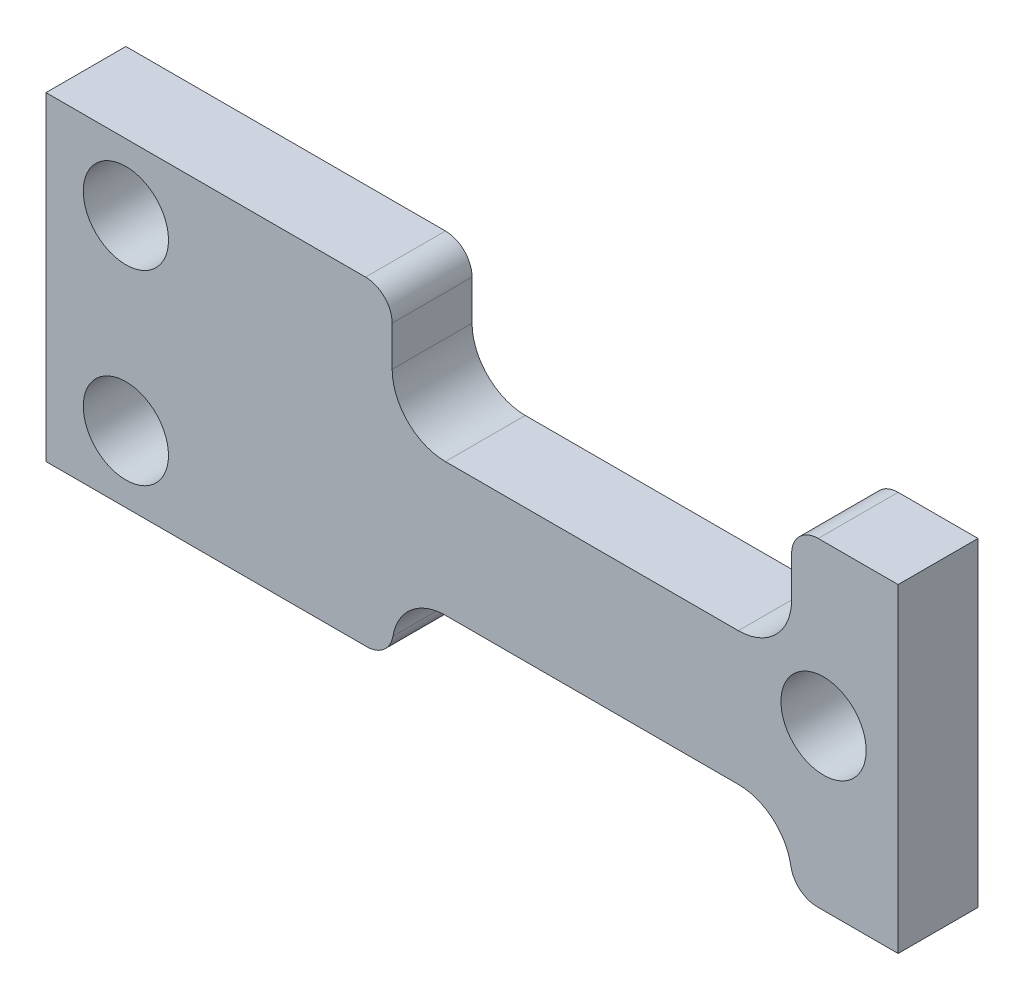
ISO-10303-21;
HEADER;
FILE_DESCRIPTION(('STEP AP214'),'2;1');
FILE_NAME('part.step','',(''),(''),'','','');
FILE_SCHEMA(('AUTOMOTIVE_DESIGN { 1 0 10303 214 1 1 1 1 }'));
ENDSEC;
DATA;
#1=APPLICATION_CONTEXT('core data for automotive mechanical design processes');
#2=APPLICATION_PROTOCOL_DEFINITION('international standard','automotive_design',2000,#1);
#3=PRODUCT_CONTEXT('',#1,'mechanical');
#4=PRODUCT('Part','Part','',(#3));
#5=PRODUCT_RELATED_PRODUCT_CATEGORY('part','',(#4));
#6=PRODUCT_DEFINITION_FORMATION('','',#4);
#7=PRODUCT_DEFINITION_CONTEXT('part definition',#1,'design');
#8=PRODUCT_DEFINITION('design','',#6,#7);
#9=PRODUCT_DEFINITION_SHAPE('','',#8);
#10=(LENGTH_UNIT() NAMED_UNIT(*) SI_UNIT(.MILLI.,.METRE.));
#11=(NAMED_UNIT(*) PLANE_ANGLE_UNIT() SI_UNIT($,.RADIAN.));
#12=(NAMED_UNIT(*) SI_UNIT($,.STERADIAN.) SOLID_ANGLE_UNIT());
#13=UNCERTAINTY_MEASURE_WITH_UNIT(LENGTH_MEASURE(1.E-05),#10,'distance_accuracy_value','');
#14=(GEOMETRIC_REPRESENTATION_CONTEXT(3) GLOBAL_UNCERTAINTY_ASSIGNED_CONTEXT((#13)) GLOBAL_UNIT_ASSIGNED_CONTEXT((#10,
#11,#12)) REPRESENTATION_CONTEXT('',''));
#15=CARTESIAN_POINT('',(0.,0.,0.));
#16=DIRECTION('',(0.,0.,1.));
#17=DIRECTION('',(1.,0.,0.));
#18=AXIS2_PLACEMENT_3D('',#15,#16,#17);
#19=CARTESIAN_POINT('',(0.,0.,3.));
#20=DIRECTION('',(0.,0.,-1.));
#21=DIRECTION('',(-1.,0.,0.));
#22=AXIS2_PLACEMENT_3D('',#19,#20,#21);
#23=PLANE('',#22);
#24=CARTESIAN_POINT('',(29.2,13.5,3.));
#25=DIRECTION('',(0.,0.,1.));
#26=DIRECTION('',(1.,0.,0.));
#27=AXIS2_PLACEMENT_3D('',#24,#25,#26);
#28=CIRCLE('',#27,1.6);
#29=CARTESIAN_POINT('',(30.8,13.5,3.));
#30=VERTEX_POINT('',#29);
#31=EDGE_CURVE('E317',#30,#30,#28,.T.);
#32=ORIENTED_EDGE('',*,*,#31,.F.);
#33=EDGE_LOOP('',(#32));
#34=FACE_BOUND('',#33,.T.);
#35=CARTESIAN_POINT('',(3.,17.,3.));
#36=DIRECTION('',(0.,0.,1.));
#37=DIRECTION('',(1.,0.,0.));
#38=AXIS2_PLACEMENT_3D('',#35,#36,#37);
#39=CIRCLE('',#38,1.6);
#40=CARTESIAN_POINT('',(4.6,17.,3.));
#41=VERTEX_POINT('',#40);
#42=EDGE_CURVE('E192',#41,#41,#39,.T.);
#43=ORIENTED_EDGE('',*,*,#42,.F.);
#44=EDGE_LOOP('',(#43));
#45=FACE_BOUND('',#44,.T.);
#46=CARTESIAN_POINT('',(3.,10.,3.));
#47=DIRECTION('',(0.,0.,1.));
#48=DIRECTION('',(1.,0.,0.));
#49=AXIS2_PLACEMENT_3D('',#46,#47,#48);
#50=CIRCLE('',#49,1.6);
#51=CARTESIAN_POINT('',(4.6,10.,3.));
#52=VERTEX_POINT('',#51);
#53=EDGE_CURVE('E288',#52,#52,#50,.T.);
#54=ORIENTED_EDGE('',*,*,#53,.F.);
#55=EDGE_LOOP('',(#54));
#56=FACE_BOUND('',#55,.T.);
#57=CARTESIAN_POINT('',(26.,8.,3.));
#58=DIRECTION('',(0.,0.,-1.));
#59=DIRECTION('',(-1.,0.,0.));
#60=AXIS2_PLACEMENT_3D('',#57,#58,#59);
#61=CIRCLE('',#60,2.);
#62=CARTESIAN_POINT('',(26.,10.,3.));
#63=VERTEX_POINT('',#62);
#64=CARTESIAN_POINT('',(27.9720265943665,8.33333333333333,3.));
#65=VERTEX_POINT('',#64);
#66=EDGE_CURVE('E222',#63,#65,#61,.T.);
#67=ORIENTED_EDGE('',*,*,#66,.T.);
#68=CARTESIAN_POINT('',(28.9580398915498,8.5,3.));
#69=DIRECTION('',(0.,0.,-1.));
#70=DIRECTION('',(-1.,0.,0.));
#71=AXIS2_PLACEMENT_3D('',#68,#69,#70);
#72=CIRCLE('',#71,1.);
#73=CARTESIAN_POINT('',(28.9580398915498,7.5,3.));
#74=VERTEX_POINT('',#73);
#75=EDGE_CURVE('E248',#65,#74,#72,.F.);
#76=ORIENTED_EDGE('',*,*,#75,.T.);
#77=DIRECTION('',(-1.,0.,0.));
#78=VECTOR('',#77,1.);
#79=CARTESIAN_POINT('',(0.,7.5,3.));
#80=LINE('',#79,#78);
#81=CARTESIAN_POINT('',(32.,7.5,3.));
#82=VERTEX_POINT('',#81);
#83=EDGE_CURVE('E309',#82,#74,#80,.T.);
#84=ORIENTED_EDGE('',*,*,#83,.F.);
#85=DIRECTION('',(0.,1.,0.));
#86=VECTOR('',#85,1.);
#87=CARTESIAN_POINT('',(32.,26.8,3.));
#88=LINE('',#87,#86);
#89=CARTESIAN_POINT('',(32.,19.5,3.));
#90=VERTEX_POINT('',#89);
#91=EDGE_CURVE('E186',#82,#90,#88,.T.);
#92=ORIENTED_EDGE('',*,*,#91,.T.);
#93=DIRECTION('',(1.,0.,0.));
#94=VECTOR('',#93,1.);
#95=CARTESIAN_POINT('',(0.,19.5,3.));
#96=LINE('',#95,#94);
#97=CARTESIAN_POINT('',(29.,19.5,3.));
#98=VERTEX_POINT('',#97);
#99=EDGE_CURVE('E300',#98,#90,#96,.T.);
#100=ORIENTED_EDGE('',*,*,#99,.F.);
#101=CARTESIAN_POINT('',(29.,18.5,3.));
#102=DIRECTION('',(0.,0.,-1.));
#103=DIRECTION('',(-1.,0.,0.));
#104=AXIS2_PLACEMENT_3D('',#101,#102,#103);
#105=CIRCLE('',#104,1.);
#106=CARTESIAN_POINT('',(28.,18.5,3.));
#107=VERTEX_POINT('',#106);
#108=EDGE_CURVE('E243',#98,#107,#105,.F.);
#109=ORIENTED_EDGE('',*,*,#108,.T.);
#110=DIRECTION('',(0.,1.,0.));
#111=VECTOR('',#110,1.);
#112=CARTESIAN_POINT('',(28.,21.,3.));
#113=LINE('',#112,#111);
#114=CARTESIAN_POINT('',(28.,17.,3.));
#115=VERTEX_POINT('',#114);
#116=EDGE_CURVE('E267',#115,#107,#113,.T.);
#117=ORIENTED_EDGE('',*,*,#116,.F.);
#118=CARTESIAN_POINT('',(26.,17.,3.));
#119=DIRECTION('',(0.,0.,-1.));
#120=DIRECTION('',(-1.,0.,0.));
#121=AXIS2_PLACEMENT_3D('',#118,#119,#120);
#122=CIRCLE('',#121,2.);
#123=CARTESIAN_POINT('',(26.,15.,3.));
#124=VERTEX_POINT('',#123);
#125=EDGE_CURVE('E213',#115,#124,#122,.T.);
#126=ORIENTED_EDGE('',*,*,#125,.T.);
#127=DIRECTION('',(1.,0.,0.));
#128=VECTOR('',#127,1.);
#129=CARTESIAN_POINT('',(13.,15.,3.));
#130=LINE('',#129,#128);
#131=CARTESIAN_POINT('',(15.,15.,3.));
#132=VERTEX_POINT('',#131);
#133=EDGE_CURVE('E275',#132,#124,#130,.T.);
#134=ORIENTED_EDGE('',*,*,#133,.F.);
#135=CARTESIAN_POINT('',(15.,17.,3.));
#136=DIRECTION('',(0.,0.,-1.));
#137=DIRECTION('',(-1.,0.,0.));
#138=AXIS2_PLACEMENT_3D('',#135,#136,#137);
#139=CIRCLE('',#138,2.);
#140=CARTESIAN_POINT('',(13.,17.,3.));
#141=VERTEX_POINT('',#140);
#142=EDGE_CURVE('E217',#132,#141,#139,.T.);
#143=ORIENTED_EDGE('',*,*,#142,.T.);
#144=DIRECTION('',(0.,-1.,0.));
#145=VECTOR('',#144,1.);
#146=CARTESIAN_POINT('',(13.,21.,3.));
#147=LINE('',#146,#145);
#148=CARTESIAN_POINT('',(13.,18.5,3.));
#149=VERTEX_POINT('',#148);
#150=EDGE_CURVE('E272',#149,#141,#147,.T.);
#151=ORIENTED_EDGE('',*,*,#150,.F.);
#152=CARTESIAN_POINT('',(12.,18.5,3.));
#153=DIRECTION('',(0.,0.,-1.));
#154=DIRECTION('',(-1.,0.,0.));
#155=AXIS2_PLACEMENT_3D('',#152,#153,#154);
#156=CIRCLE('',#155,1.);
#157=CARTESIAN_POINT('',(12.,19.5,3.));
#158=VERTEX_POINT('',#157);
#159=EDGE_CURVE('E245',#149,#158,#156,.F.);
#160=ORIENTED_EDGE('',*,*,#159,.T.);
#161=CARTESIAN_POINT('',(0.,19.5,3.));
#162=VERTEX_POINT('',#161);
#163=EDGE_CURVE('E298',#162,#158,#96,.T.);
#164=ORIENTED_EDGE('',*,*,#163,.F.);
#165=DIRECTION('',(0.,-1.,0.));
#166=VECTOR('',#165,1.);
#167=CARTESIAN_POINT('',(0.,0.,3.));
#168=LINE('',#167,#166);
#169=CARTESIAN_POINT('',(0.,7.5,3.));
#170=VERTEX_POINT('',#169);
#171=EDGE_CURVE('E177',#162,#170,#168,.T.);
#172=ORIENTED_EDGE('',*,*,#171,.T.);
#173=CARTESIAN_POINT('',(12.0419601084502,7.5,3.));
#174=VERTEX_POINT('',#173);
#175=EDGE_CURVE('E297',#174,#170,#80,.T.);
#176=ORIENTED_EDGE('',*,*,#175,.F.);
#177=CARTESIAN_POINT('',(12.0419601084502,8.5,3.));
#178=DIRECTION('',(0.,0.,-1.));
#179=DIRECTION('',(-1.,0.,0.));
#180=AXIS2_PLACEMENT_3D('',#177,#178,#179);
#181=CIRCLE('',#180,1.);
#182=CARTESIAN_POINT('',(13.0279734056335,8.33333333333333,3.));
#183=VERTEX_POINT('',#182);
#184=EDGE_CURVE('E49',#174,#183,#181,.F.);
#185=ORIENTED_EDGE('',*,*,#184,.T.);
#186=CARTESIAN_POINT('',(15.,8.,3.));
#187=DIRECTION('',(0.,0.,-1.));
#188=DIRECTION('',(-1.,0.,0.));
#189=AXIS2_PLACEMENT_3D('',#186,#187,#188);
#190=CIRCLE('',#189,2.);
#191=CARTESIAN_POINT('',(15.,10.,3.));
#192=VERTEX_POINT('',#191);
#193=EDGE_CURVE('E228',#183,#192,#190,.T.);
#194=ORIENTED_EDGE('',*,*,#193,.T.);
#195=DIRECTION('',(-1.,0.,0.));
#196=VECTOR('',#195,1.);
#197=CARTESIAN_POINT('',(13.,10.,3.));
#198=LINE('',#197,#196);
#199=EDGE_CURVE('E281',#63,#192,#198,.T.);
#200=ORIENTED_EDGE('',*,*,#199,.F.);
#201=EDGE_LOOP('',(#67,#76,#84,#92,#100,#109,#117,#126,#134,#143,#151,#160,#164,#172,#176,#185,
#194,#200));
#202=FACE_BOUND('',#201,.T.);
#203=ADVANCED_FACE('F34',(#34,#45,#56,#202),#23,.F.);
#204=CARTESIAN_POINT('',(0.,0.,0.));
#205=DIRECTION('',(0.,0.,-1.));
#206=DIRECTION('',(-1.,0.,0.));
#207=AXIS2_PLACEMENT_3D('',#204,#205,#206);
#208=PLANE('',#207);
#209=DIRECTION('',(-1.,0.,0.));
#210=VECTOR('',#209,1.);
#211=CARTESIAN_POINT('',(0.,7.5,0.));
#212=LINE('',#211,#210);
#213=CARTESIAN_POINT('',(32.,7.5,0.));
#214=VERTEX_POINT('',#213);
#215=CARTESIAN_POINT('',(28.9580398915498,7.5,0.));
#216=VERTEX_POINT('',#215);
#217=EDGE_CURVE('E306',#214,#216,#212,.T.);
#218=ORIENTED_EDGE('',*,*,#217,.T.);
#219=CARTESIAN_POINT('',(28.9580398915498,8.5,0.));
#220=DIRECTION('',(0.,0.,-1.));
#221=DIRECTION('',(-1.,0.,0.));
#222=AXIS2_PLACEMENT_3D('',#219,#220,#221);
#223=CIRCLE('',#222,1.);
#224=CARTESIAN_POINT('',(27.9720265943665,8.33333333333333,0.));
#225=VERTEX_POINT('',#224);
#226=EDGE_CURVE('E239',#216,#225,#223,.T.);
#227=ORIENTED_EDGE('',*,*,#226,.T.);
#228=CARTESIAN_POINT('',(26.,8.,0.));
#229=DIRECTION('',(0.,0.,-1.));
#230=DIRECTION('',(-1.,0.,0.));
#231=AXIS2_PLACEMENT_3D('',#228,#229,#230);
#232=CIRCLE('',#231,2.);
#233=CARTESIAN_POINT('',(26.,10.,0.));
#234=VERTEX_POINT('',#233);
#235=EDGE_CURVE('E220',#225,#234,#232,.F.);
#236=ORIENTED_EDGE('',*,*,#235,.T.);
#237=DIRECTION('',(-1.,0.,0.));
#238=VECTOR('',#237,1.);
#239=CARTESIAN_POINT('',(13.,10.,0.));
#240=LINE('',#239,#238);
#241=CARTESIAN_POINT('',(15.,10.,0.));
#242=VERTEX_POINT('',#241);
#243=EDGE_CURVE('E285',#234,#242,#240,.T.);
#244=ORIENTED_EDGE('',*,*,#243,.T.);
#245=CARTESIAN_POINT('',(15.,8.,0.));
#246=DIRECTION('',(0.,0.,-1.));
#247=DIRECTION('',(-1.,0.,0.));
#248=AXIS2_PLACEMENT_3D('',#245,#246,#247);
#249=CIRCLE('',#248,2.);
#250=CARTESIAN_POINT('',(13.0279734056335,8.33333333333333,0.));
#251=VERTEX_POINT('',#250);
#252=EDGE_CURVE('E225',#242,#251,#249,.F.);
#253=ORIENTED_EDGE('',*,*,#252,.T.);
#254=CARTESIAN_POINT('',(12.0419601084502,8.5,0.));
#255=DIRECTION('',(0.,0.,-1.));
#256=DIRECTION('',(-1.,0.,0.));
#257=AXIS2_PLACEMENT_3D('',#254,#255,#256);
#258=CIRCLE('',#257,1.);
#259=CARTESIAN_POINT('',(12.0419601084502,7.5,0.));
#260=VERTEX_POINT('',#259);
#261=EDGE_CURVE('E237',#251,#260,#258,.T.);
#262=ORIENTED_EDGE('',*,*,#261,.T.);
#263=CARTESIAN_POINT('',(0.,7.5,0.));
#264=VERTEX_POINT('',#263);
#265=EDGE_CURVE('E184',#260,#264,#212,.T.);
#266=ORIENTED_EDGE('',*,*,#265,.T.);
#267=DIRECTION('',(0.,-1.,0.));
#268=VECTOR('',#267,1.);
#269=CARTESIAN_POINT('',(0.,0.,0.));
#270=LINE('',#269,#268);
#271=CARTESIAN_POINT('',(0.,19.5,0.));
#272=VERTEX_POINT('',#271);
#273=EDGE_CURVE('E175',#272,#264,#270,.T.);
#274=ORIENTED_EDGE('',*,*,#273,.F.);
#275=DIRECTION('',(1.,0.,0.));
#276=VECTOR('',#275,1.);
#277=CARTESIAN_POINT('',(0.,19.5,0.));
#278=LINE('',#277,#276);
#279=CARTESIAN_POINT('',(12.,19.5,0.));
#280=VERTEX_POINT('',#279);
#281=EDGE_CURVE('E157',#272,#280,#278,.T.);
#282=ORIENTED_EDGE('',*,*,#281,.T.);
#283=CARTESIAN_POINT('',(12.,18.5,0.));
#284=DIRECTION('',(0.,0.,-1.));
#285=DIRECTION('',(-1.,0.,0.));
#286=AXIS2_PLACEMENT_3D('',#283,#284,#285);
#287=CIRCLE('',#286,1.);
#288=CARTESIAN_POINT('',(13.,18.5,0.));
#289=VERTEX_POINT('',#288);
#290=EDGE_CURVE('E235',#280,#289,#287,.T.);
#291=ORIENTED_EDGE('',*,*,#290,.T.);
#292=DIRECTION('',(0.,-1.,0.));
#293=VECTOR('',#292,1.);
#294=CARTESIAN_POINT('',(13.,21.,0.));
#295=LINE('',#294,#293);
#296=CARTESIAN_POINT('',(13.,17.,0.));
#297=VERTEX_POINT('',#296);
#298=EDGE_CURVE('E277',#289,#297,#295,.T.);
#299=ORIENTED_EDGE('',*,*,#298,.T.);
#300=CARTESIAN_POINT('',(15.,17.,0.));
#301=DIRECTION('',(0.,0.,-1.));
#302=DIRECTION('',(-1.,0.,0.));
#303=AXIS2_PLACEMENT_3D('',#300,#301,#302);
#304=CIRCLE('',#303,2.);
#305=CARTESIAN_POINT('',(15.,15.,0.));
#306=VERTEX_POINT('',#305);
#307=EDGE_CURVE('E215',#297,#306,#304,.F.);
#308=ORIENTED_EDGE('',*,*,#307,.T.);
#309=DIRECTION('',(1.,0.,0.));
#310=VECTOR('',#309,1.);
#311=CARTESIAN_POINT('',(13.,15.,0.));
#312=LINE('',#311,#310);
#313=CARTESIAN_POINT('',(26.,15.,0.));
#314=VERTEX_POINT('',#313);
#315=EDGE_CURVE('E273',#306,#314,#312,.T.);
#316=ORIENTED_EDGE('',*,*,#315,.T.);
#317=CARTESIAN_POINT('',(26.,17.,0.));
#318=DIRECTION('',(0.,0.,-1.));
#319=DIRECTION('',(-1.,0.,0.));
#320=AXIS2_PLACEMENT_3D('',#317,#318,#319);
#321=CIRCLE('',#320,2.);
#322=CARTESIAN_POINT('',(28.,17.,0.));
#323=VERTEX_POINT('',#322);
#324=EDGE_CURVE('E211',#314,#323,#321,.F.);
#325=ORIENTED_EDGE('',*,*,#324,.T.);
#326=DIRECTION('',(0.,1.,0.));
#327=VECTOR('',#326,1.);
#328=CARTESIAN_POINT('',(28.,21.,0.));
#329=LINE('',#328,#327);
#330=CARTESIAN_POINT('',(28.,18.5,0.));
#331=VERTEX_POINT('',#330);
#332=EDGE_CURVE('E264',#323,#331,#329,.T.);
#333=ORIENTED_EDGE('',*,*,#332,.T.);
#334=CARTESIAN_POINT('',(29.,18.5,0.));
#335=DIRECTION('',(0.,0.,-1.));
#336=DIRECTION('',(-1.,0.,0.));
#337=AXIS2_PLACEMENT_3D('',#334,#335,#336);
#338=CIRCLE('',#337,1.);
#339=CARTESIAN_POINT('',(29.,19.5,0.));
#340=VERTEX_POINT('',#339);
#341=EDGE_CURVE('E233',#331,#340,#338,.T.);
#342=ORIENTED_EDGE('',*,*,#341,.T.);
#343=CARTESIAN_POINT('',(32.,19.5,0.));
#344=VERTEX_POINT('',#343);
#345=EDGE_CURVE('E168',#340,#344,#278,.T.);
#346=ORIENTED_EDGE('',*,*,#345,.T.);
#347=DIRECTION('',(0.,1.,0.));
#348=VECTOR('',#347,1.);
#349=CARTESIAN_POINT('',(32.,26.8,0.));
#350=LINE('',#349,#348);
#351=EDGE_CURVE('E187',#214,#344,#350,.T.);
#352=ORIENTED_EDGE('',*,*,#351,.F.);
#353=EDGE_LOOP('',(#218,#227,#236,#244,#253,#262,#266,#274,#282,#291,#299,#308,#316,#325,#333,
#342,#346,#352));
#354=FACE_BOUND('',#353,.T.);
#355=CARTESIAN_POINT('',(29.2,13.5,0.));
#356=DIRECTION('',(0.,0.,1.));
#357=DIRECTION('',(1.,0.,0.));
#358=AXIS2_PLACEMENT_3D('',#355,#356,#357);
#359=CIRCLE('',#358,1.6);
#360=CARTESIAN_POINT('',(30.8,13.5,0.));
#361=VERTEX_POINT('',#360);
#362=EDGE_CURVE('E314',#361,#361,#359,.T.);
#363=ORIENTED_EDGE('',*,*,#362,.T.);
#364=EDGE_LOOP('',(#363));
#365=FACE_BOUND('',#364,.T.);
#366=CARTESIAN_POINT('',(3.,17.,0.));
#367=DIRECTION('',(0.,0.,1.));
#368=DIRECTION('',(1.,0.,0.));
#369=AXIS2_PLACEMENT_3D('',#366,#367,#368);
#370=CIRCLE('',#369,1.6);
#371=CARTESIAN_POINT('',(4.6,17.,0.));
#372=VERTEX_POINT('',#371);
#373=EDGE_CURVE('E291',#372,#372,#370,.T.);
#374=ORIENTED_EDGE('',*,*,#373,.T.);
#375=EDGE_LOOP('',(#374));
#376=FACE_BOUND('',#375,.T.);
#377=CARTESIAN_POINT('',(3.,10.,0.));
#378=DIRECTION('',(0.,0.,1.));
#379=DIRECTION('',(1.,0.,0.));
#380=AXIS2_PLACEMENT_3D('',#377,#378,#379);
#381=CIRCLE('',#380,1.6);
#382=CARTESIAN_POINT('',(4.6,10.,0.));
#383=VERTEX_POINT('',#382);
#384=EDGE_CURVE('E284',#383,#383,#381,.T.);
#385=ORIENTED_EDGE('',*,*,#384,.T.);
#386=EDGE_LOOP('',(#385));
#387=FACE_BOUND('',#386,.T.);
#388=ADVANCED_FACE('F181',(#354,#365,#376,#387),#208,.T.);
#389=CARTESIAN_POINT('',(32.,26.8,3.));
#390=DIRECTION('',(-1.,0.,0.));
#391=DIRECTION('',(0.,0.,1.));
#392=AXIS2_PLACEMENT_3D('',#389,#390,#391);
#393=PLANE('',#392);
#394=ORIENTED_EDGE('',*,*,#351,.T.);
#395=DIRECTION('',(0.,0.,1.));
#396=VECTOR('',#395,1.);
#397=CARTESIAN_POINT('',(32.,19.5,0.));
#398=LINE('',#397,#396);
#399=EDGE_CURVE('E178',#344,#90,#398,.T.);
#400=ORIENTED_EDGE('',*,*,#399,.T.);
#401=ORIENTED_EDGE('',*,*,#91,.F.);
#402=DIRECTION('',(0.,0.,1.));
#403=VECTOR('',#402,1.);
#404=CARTESIAN_POINT('',(32.,7.5,0.));
#405=LINE('',#404,#403);
#406=EDGE_CURVE('E308',#214,#82,#405,.T.);
#407=ORIENTED_EDGE('',*,*,#406,.F.);
#408=EDGE_LOOP('',(#394,#400,#401,#407));
#409=FACE_BOUND('',#408,.T.);
#410=ADVANCED_FACE('F348',(#409),#393,.F.);
#411=CARTESIAN_POINT('',(0.,0.,3.));
#412=DIRECTION('',(1.,0.,0.));
#413=DIRECTION('',(0.,0.,-1.));
#414=AXIS2_PLACEMENT_3D('',#411,#412,#413);
#415=PLANE('',#414);
#416=ORIENTED_EDGE('',*,*,#171,.F.);
#417=DIRECTION('',(0.,0.,1.));
#418=VECTOR('',#417,1.);
#419=CARTESIAN_POINT('',(0.,19.5,0.));
#420=LINE('',#419,#418);
#421=EDGE_CURVE('E161',#272,#162,#420,.T.);
#422=ORIENTED_EDGE('',*,*,#421,.F.);
#423=ORIENTED_EDGE('',*,*,#273,.T.);
#424=DIRECTION('',(0.,0.,1.));
#425=VECTOR('',#424,1.);
#426=CARTESIAN_POINT('',(0.,7.5,0.));
#427=LINE('',#426,#425);
#428=EDGE_CURVE('E302',#264,#170,#427,.T.);
#429=ORIENTED_EDGE('',*,*,#428,.T.);
#430=EDGE_LOOP('',(#416,#422,#423,#429));
#431=FACE_BOUND('',#430,.T.);
#432=ADVANCED_FACE('F173',(#431),#415,.F.);
#433=CARTESIAN_POINT('',(3.,17.,3.));
#434=DIRECTION('',(0.,0.,-1.));
#435=DIRECTION('',(-1.,0.,0.));
#436=AXIS2_PLACEMENT_3D('',#433,#434,#435);
#437=CYLINDRICAL_SURFACE('',#436,1.6);
#438=ORIENTED_EDGE('',*,*,#42,.T.);
#439=EDGE_LOOP('',(#438));
#440=FACE_BOUND('',#439,.T.);
#441=ORIENTED_EDGE('',*,*,#373,.F.);
#442=EDGE_LOOP('',(#441));
#443=FACE_BOUND('',#442,.T.);
#444=ADVANCED_FACE('F394',(#440,#443),#437,.F.);
#445=CARTESIAN_POINT('',(3.,10.,3.));
#446=DIRECTION('',(0.,0.,-1.));
#447=DIRECTION('',(-1.,0.,0.));
#448=AXIS2_PLACEMENT_3D('',#445,#446,#447);
#449=CYLINDRICAL_SURFACE('',#448,1.6);
#450=ORIENTED_EDGE('',*,*,#53,.T.);
#451=EDGE_LOOP('',(#450));
#452=FACE_BOUND('',#451,.T.);
#453=ORIENTED_EDGE('',*,*,#384,.F.);
#454=EDGE_LOOP('',(#453));
#455=FACE_BOUND('',#454,.T.);
#456=ADVANCED_FACE('F547',(#452,#455),#449,.F.);
#457=CARTESIAN_POINT('',(13.,10.,3.));
#458=DIRECTION('',(0.,-1.,0.));
#459=DIRECTION('',(0.,0.,-1.));
#460=AXIS2_PLACEMENT_3D('',#457,#458,#459);
#461=PLANE('',#460);
#462=ORIENTED_EDGE('',*,*,#243,.F.);
#463=DIRECTION('',(0.,0.,-1.));
#464=VECTOR('',#463,1.);
#465=CARTESIAN_POINT('',(26.,10.,3.));
#466=LINE('',#465,#464);
#467=EDGE_CURVE('E209',#234,#63,#466,.F.);
#468=ORIENTED_EDGE('',*,*,#467,.T.);
#469=ORIENTED_EDGE('',*,*,#199,.T.);
#470=DIRECTION('',(0.,0.,-1.));
#471=VECTOR('',#470,1.);
#472=CARTESIAN_POINT('',(15.,10.,0.));
#473=LINE('',#472,#471);
#474=EDGE_CURVE('E206',#192,#242,#473,.T.);
#475=ORIENTED_EDGE('',*,*,#474,.T.);
#476=EDGE_LOOP('',(#462,#468,#469,#475));
#477=FACE_BOUND('',#476,.T.);
#478=ADVANCED_FACE('F366',(#477),#461,.T.);
#479=CARTESIAN_POINT('',(13.,21.,3.));
#480=DIRECTION('',(1.,0.,0.));
#481=DIRECTION('',(0.,0.,-1.));
#482=AXIS2_PLACEMENT_3D('',#479,#480,#481);
#483=PLANE('',#482);
#484=ORIENTED_EDGE('',*,*,#298,.F.);
#485=DIRECTION('',(0.,0.,1.));
#486=VECTOR('',#485,1.);
#487=CARTESIAN_POINT('',(13.,18.5,3.));
#488=LINE('',#487,#486);
#489=EDGE_CURVE('E254',#289,#149,#488,.T.);
#490=ORIENTED_EDGE('',*,*,#489,.T.);
#491=ORIENTED_EDGE('',*,*,#150,.T.);
#492=DIRECTION('',(0.,0.,-1.));
#493=VECTOR('',#492,1.);
#494=CARTESIAN_POINT('',(13.,17.,0.));
#495=LINE('',#494,#493);
#496=EDGE_CURVE('E203',#141,#297,#495,.T.);
#497=ORIENTED_EDGE('',*,*,#496,.T.);
#498=EDGE_LOOP('',(#484,#490,#491,#497));
#499=FACE_BOUND('',#498,.T.);
#500=ADVANCED_FACE('F332',(#499),#483,.T.);
#501=CARTESIAN_POINT('',(13.,15.,3.));
#502=DIRECTION('',(0.,1.,0.));
#503=DIRECTION('',(0.,0.,1.));
#504=AXIS2_PLACEMENT_3D('',#501,#502,#503);
#505=PLANE('',#504);
#506=ORIENTED_EDGE('',*,*,#133,.T.);
#507=DIRECTION('',(0.,0.,-1.));
#508=VECTOR('',#507,1.);
#509=CARTESIAN_POINT('',(26.,15.,0.));
#510=LINE('',#509,#508);
#511=EDGE_CURVE('E198',#124,#314,#510,.T.);
#512=ORIENTED_EDGE('',*,*,#511,.T.);
#513=ORIENTED_EDGE('',*,*,#315,.F.);
#514=DIRECTION('',(0.,0.,-1.));
#515=VECTOR('',#514,1.);
#516=CARTESIAN_POINT('',(15.,15.,3.));
#517=LINE('',#516,#515);
#518=EDGE_CURVE('E196',#306,#132,#517,.F.);
#519=ORIENTED_EDGE('',*,*,#518,.T.);
#520=EDGE_LOOP('',(#506,#512,#513,#519));
#521=FACE_BOUND('',#520,.T.);
#522=ADVANCED_FACE('F337',(#521),#505,.T.);
#523=CARTESIAN_POINT('',(28.,21.,3.));
#524=DIRECTION('',(-1.,0.,0.));
#525=DIRECTION('',(0.,-1.,0.));
#526=AXIS2_PLACEMENT_3D('',#523,#524,#525);
#527=PLANE('',#526);
#528=ORIENTED_EDGE('',*,*,#116,.T.);
#529=DIRECTION('',(0.,0.,-1.));
#530=VECTOR('',#529,1.);
#531=CARTESIAN_POINT('',(28.,18.5,0.));
#532=LINE('',#531,#530);
#533=EDGE_CURVE('E42',#107,#331,#532,.T.);
#534=ORIENTED_EDGE('',*,*,#533,.T.);
#535=ORIENTED_EDGE('',*,*,#332,.F.);
#536=DIRECTION('',(0.,0.,-1.));
#537=VECTOR('',#536,1.);
#538=CARTESIAN_POINT('',(28.,17.,3.));
#539=LINE('',#538,#537);
#540=EDGE_CURVE('E201',#323,#115,#539,.F.);
#541=ORIENTED_EDGE('',*,*,#540,.T.);
#542=EDGE_LOOP('',(#528,#534,#535,#541));
#543=FACE_BOUND('',#542,.T.);
#544=ADVANCED_FACE('F263',(#543),#527,.T.);
#545=CARTESIAN_POINT('',(26.,17.,3.));
#546=DIRECTION('',(0.,0.,1.));
#547=DIRECTION('',(1.,0.,0.));
#548=AXIS2_PLACEMENT_3D('',#545,#546,#547);
#549=CYLINDRICAL_SURFACE('',#548,2.);
#550=ORIENTED_EDGE('',*,*,#125,.F.);
#551=ORIENTED_EDGE('',*,*,#540,.F.);
#552=ORIENTED_EDGE('',*,*,#324,.F.);
#553=ORIENTED_EDGE('',*,*,#511,.F.);
#554=EDGE_LOOP('',(#550,#551,#552,#553));
#555=FACE_BOUND('',#554,.T.);
#556=ADVANCED_FACE('F339',(#555),#549,.F.);
#557=CARTESIAN_POINT('',(15.,17.,3.));
#558=DIRECTION('',(0.,0.,1.));
#559=DIRECTION('',(1.,0.,0.));
#560=AXIS2_PLACEMENT_3D('',#557,#558,#559);
#561=CYLINDRICAL_SURFACE('',#560,2.);
#562=ORIENTED_EDGE('',*,*,#142,.F.);
#563=ORIENTED_EDGE('',*,*,#518,.F.);
#564=ORIENTED_EDGE('',*,*,#307,.F.);
#565=ORIENTED_EDGE('',*,*,#496,.F.);
#566=EDGE_LOOP('',(#562,#563,#564,#565));
#567=FACE_BOUND('',#566,.T.);
#568=ADVANCED_FACE('F331',(#567),#561,.F.);
#569=CARTESIAN_POINT('',(26.,8.,3.));
#570=DIRECTION('',(0.,0.,1.));
#571=DIRECTION('',(1.,0.,0.));
#572=AXIS2_PLACEMENT_3D('',#569,#570,#571);
#573=CYLINDRICAL_SURFACE('',#572,2.);
#574=ORIENTED_EDGE('',*,*,#235,.F.);
#575=DIRECTION('',(0.,0.,1.));
#576=VECTOR('',#575,1.);
#577=CARTESIAN_POINT('',(27.9720265943665,8.33333333333333,3.));
#578=LINE('',#577,#576);
#579=EDGE_CURVE('E241',#225,#65,#578,.T.);
#580=ORIENTED_EDGE('',*,*,#579,.T.);
#581=ORIENTED_EDGE('',*,*,#66,.F.);
#582=ORIENTED_EDGE('',*,*,#467,.F.);
#583=EDGE_LOOP('',(#574,#580,#581,#582));
#584=FACE_BOUND('',#583,.T.);
#585=ADVANCED_FACE('F364',(#584),#573,.F.);
#586=CARTESIAN_POINT('',(15.,8.,3.));
#587=DIRECTION('',(0.,0.,1.));
#588=DIRECTION('',(1.,0.,0.));
#589=AXIS2_PLACEMENT_3D('',#586,#587,#588);
#590=CYLINDRICAL_SURFACE('',#589,2.);
#591=ORIENTED_EDGE('',*,*,#193,.F.);
#592=DIRECTION('',(0.,0.,1.));
#593=VECTOR('',#592,1.);
#594=CARTESIAN_POINT('',(13.0279734056335,8.33333333333333,3.));
#595=LINE('',#594,#593);
#596=EDGE_CURVE('E252',#183,#251,#595,.F.);
#597=ORIENTED_EDGE('',*,*,#596,.T.);
#598=ORIENTED_EDGE('',*,*,#252,.F.);
#599=ORIENTED_EDGE('',*,*,#474,.F.);
#600=EDGE_LOOP('',(#591,#597,#598,#599));
#601=FACE_BOUND('',#600,.T.);
#602=ADVANCED_FACE('F369',(#601),#590,.F.);
#603=CARTESIAN_POINT('',(0.,19.5,0.));
#604=DIRECTION('',(0.,-1.,0.));
#605=DIRECTION('',(0.,0.,-1.));
#606=AXIS2_PLACEMENT_3D('',#603,#604,#605);
#607=PLANE('',#606);
#608=ORIENTED_EDGE('',*,*,#163,.T.);
#609=DIRECTION('',(0.,0.,1.));
#610=VECTOR('',#609,1.);
#611=CARTESIAN_POINT('',(12.,19.5,0.));
#612=LINE('',#611,#610);
#613=EDGE_CURVE('E164',#158,#280,#612,.F.);
#614=ORIENTED_EDGE('',*,*,#613,.T.);
#615=ORIENTED_EDGE('',*,*,#281,.F.);
#616=ORIENTED_EDGE('',*,*,#421,.T.);
#617=EDGE_LOOP('',(#608,#614,#615,#616));
#618=FACE_BOUND('',#617,.T.);
#619=ADVANCED_FACE('F160',(#618),#607,.F.);
#620=ORIENTED_EDGE('',*,*,#345,.F.);
#621=DIRECTION('',(0.,0.,-1.));
#622=VECTOR('',#621,1.);
#623=CARTESIAN_POINT('',(29.,19.5,3.));
#624=LINE('',#623,#622);
#625=EDGE_CURVE('E11',#340,#98,#624,.F.);
#626=ORIENTED_EDGE('',*,*,#625,.T.);
#627=ORIENTED_EDGE('',*,*,#99,.T.);
#628=ORIENTED_EDGE('',*,*,#399,.F.);
#629=EDGE_LOOP('',(#620,#626,#627,#628));
#630=FACE_BOUND('',#629,.T.);
#631=ADVANCED_FACE('F343',(#630),#607,.F.);
#632=CARTESIAN_POINT('',(0.,7.5,0.));
#633=DIRECTION('',(0.,1.,0.));
#634=DIRECTION('',(0.,0.,1.));
#635=AXIS2_PLACEMENT_3D('',#632,#633,#634);
#636=PLANE('',#635);
#637=ORIENTED_EDGE('',*,*,#83,.T.);
#638=DIRECTION('',(0.,0.,1.));
#639=VECTOR('',#638,1.);
#640=CARTESIAN_POINT('',(28.9580398915498,7.5,0.));
#641=LINE('',#640,#639);
#642=EDGE_CURVE('E230',#74,#216,#641,.F.);
#643=ORIENTED_EDGE('',*,*,#642,.T.);
#644=ORIENTED_EDGE('',*,*,#217,.F.);
#645=ORIENTED_EDGE('',*,*,#406,.T.);
#646=EDGE_LOOP('',(#637,#643,#644,#645));
#647=FACE_BOUND('',#646,.T.);
#648=ADVANCED_FACE('F352',(#647),#636,.F.);
#649=ORIENTED_EDGE('',*,*,#265,.F.);
#650=DIRECTION('',(0.,0.,1.));
#651=VECTOR('',#650,1.);
#652=CARTESIAN_POINT('',(12.0419601084502,7.5,0.));
#653=LINE('',#652,#651);
#654=EDGE_CURVE('E250',#260,#174,#653,.T.);
#655=ORIENTED_EDGE('',*,*,#654,.T.);
#656=ORIENTED_EDGE('',*,*,#175,.T.);
#657=ORIENTED_EDGE('',*,*,#428,.F.);
#658=EDGE_LOOP('',(#649,#655,#656,#657));
#659=FACE_BOUND('',#658,.T.);
#660=ADVANCED_FACE('F373',(#659),#636,.F.);
#661=CARTESIAN_POINT('',(29.2,13.5,0.));
#662=DIRECTION('',(0.,0.,1.));
#663=DIRECTION('',(1.,0.,0.));
#664=AXIS2_PLACEMENT_3D('',#661,#662,#663);
#665=CYLINDRICAL_SURFACE('',#664,1.6);
#666=ORIENTED_EDGE('',*,*,#362,.F.);
#667=EDGE_LOOP('',(#666));
#668=FACE_BOUND('',#667,.T.);
#669=ORIENTED_EDGE('',*,*,#31,.T.);
#670=EDGE_LOOP('',(#669));
#671=FACE_BOUND('',#670,.T.);
#672=ADVANCED_FACE('F375',(#668,#671),#665,.F.);
#673=CARTESIAN_POINT('',(28.9580398915498,8.5,3.));
#674=DIRECTION('',(0.,0.,1.));
#675=DIRECTION('',(1.,0.,0.));
#676=AXIS2_PLACEMENT_3D('',#673,#674,#675);
#677=CYLINDRICAL_SURFACE('',#676,1.);
#678=ORIENTED_EDGE('',*,*,#75,.F.);
#679=ORIENTED_EDGE('',*,*,#579,.F.);
#680=ORIENTED_EDGE('',*,*,#226,.F.);
#681=ORIENTED_EDGE('',*,*,#642,.F.);
#682=EDGE_LOOP('',(#678,#679,#680,#681));
#683=FACE_BOUND('',#682,.T.);
#684=ADVANCED_FACE('F359',(#683),#677,.T.);
#685=CARTESIAN_POINT('',(12.0419601084502,8.5,3.));
#686=DIRECTION('',(0.,0.,1.));
#687=DIRECTION('',(1.,0.,0.));
#688=AXIS2_PLACEMENT_3D('',#685,#686,#687);
#689=CYLINDRICAL_SURFACE('',#688,1.);
#690=ORIENTED_EDGE('',*,*,#261,.F.);
#691=ORIENTED_EDGE('',*,*,#596,.F.);
#692=ORIENTED_EDGE('',*,*,#184,.F.);
#693=ORIENTED_EDGE('',*,*,#654,.F.);
#694=EDGE_LOOP('',(#690,#691,#692,#693));
#695=FACE_BOUND('',#694,.T.);
#696=ADVANCED_FACE('F371',(#695),#689,.T.);
#697=CARTESIAN_POINT('',(12.,18.5,3.));
#698=DIRECTION('',(0.,0.,-1.));
#699=DIRECTION('',(-1.,0.,0.));
#700=AXIS2_PLACEMENT_3D('',#697,#698,#699);
#701=CYLINDRICAL_SURFACE('',#700,1.);
#702=ORIENTED_EDGE('',*,*,#290,.F.);
#703=ORIENTED_EDGE('',*,*,#613,.F.);
#704=ORIENTED_EDGE('',*,*,#159,.F.);
#705=ORIENTED_EDGE('',*,*,#489,.F.);
#706=EDGE_LOOP('',(#702,#703,#704,#705));
#707=FACE_BOUND('',#706,.T.);
#708=ADVANCED_FACE('F412',(#707),#701,.T.);
#709=CARTESIAN_POINT('',(29.,18.5,3.));
#710=DIRECTION('',(0.,0.,1.));
#711=DIRECTION('',(1.,0.,0.));
#712=AXIS2_PLACEMENT_3D('',#709,#710,#711);
#713=CYLINDRICAL_SURFACE('',#712,1.);
#714=ORIENTED_EDGE('',*,*,#108,.F.);
#715=ORIENTED_EDGE('',*,*,#625,.F.);
#716=ORIENTED_EDGE('',*,*,#341,.F.);
#717=ORIENTED_EDGE('',*,*,#533,.F.);
#718=EDGE_LOOP('',(#714,#715,#716,#717));
#719=FACE_BOUND('',#718,.T.);
#720=ADVANCED_FACE('F36',(#719),#713,.T.);
#721=CLOSED_SHELL('',(#203,#388,#410,#432,#444,#456,#478,#500,#522,#544,#556,#568,#585,#602,
#619,#631,#648,#660,#672,#684,#696,#708,#720));
#722=MANIFOLD_SOLID_BREP('B2',#721);
#723=ADVANCED_BREP_SHAPE_REPRESENTATION('',(#18,#722),#14);
#724=SHAPE_DEFINITION_REPRESENTATION(#9,#723);
ENDSEC;
END-ISO-10303-21;
